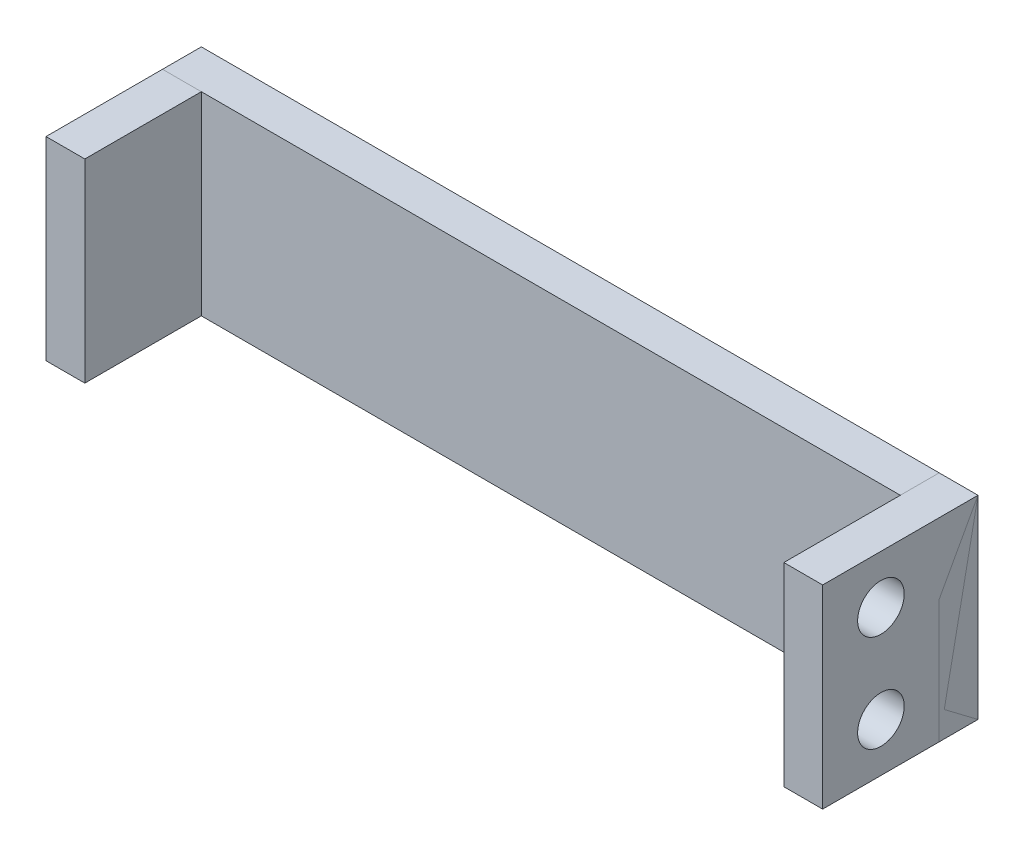
ISO-10303-21;
HEADER;
FILE_DESCRIPTION(('STEP AP214'),'2;1');
FILE_NAME('part.step','',(''),(''),'','','');
FILE_SCHEMA(('AUTOMOTIVE_DESIGN { 1 0 10303 214 1 1 1 1 }'));
ENDSEC;
DATA;
#1=APPLICATION_CONTEXT('core data for automotive mechanical design processes');
#2=APPLICATION_PROTOCOL_DEFINITION('international standard','automotive_design',2000,#1);
#3=PRODUCT_CONTEXT('',#1,'mechanical');
#4=PRODUCT('Part','Part','',(#3));
#5=PRODUCT_RELATED_PRODUCT_CATEGORY('part','',(#4));
#6=PRODUCT_DEFINITION_FORMATION('','',#4);
#7=PRODUCT_DEFINITION_CONTEXT('part definition',#1,'design');
#8=PRODUCT_DEFINITION('design','',#6,#7);
#9=PRODUCT_DEFINITION_SHAPE('','',#8);
#10=(LENGTH_UNIT() NAMED_UNIT(*) SI_UNIT(.MILLI.,.METRE.));
#11=(NAMED_UNIT(*) PLANE_ANGLE_UNIT() SI_UNIT($,.RADIAN.));
#12=(NAMED_UNIT(*) SI_UNIT($,.STERADIAN.) SOLID_ANGLE_UNIT());
#13=UNCERTAINTY_MEASURE_WITH_UNIT(LENGTH_MEASURE(1.E-05),#10,'distance_accuracy_value','');
#14=(GEOMETRIC_REPRESENTATION_CONTEXT(3) GLOBAL_UNCERTAINTY_ASSIGNED_CONTEXT((#13)) GLOBAL_UNIT_ASSIGNED_CONTEXT((#10,
#11,#12)) REPRESENTATION_CONTEXT('',''));
#15=CARTESIAN_POINT('',(0.,0.,0.));
#16=DIRECTION('',(0.,0.,1.));
#17=DIRECTION('',(1.,0.,0.));
#18=AXIS2_PLACEMENT_3D('',#15,#16,#17);
#19=CARTESIAN_POINT('',(-45.72,12.7,-10.16));
#20=DIRECTION('',(0.,0.,-1.));
#21=DIRECTION('',(0.,1.,0.));
#22=AXIS2_PLACEMENT_3D('',#19,#20,#21);
#23=PLANE('',#22);
#24=DIRECTION('',(0.,-1.,0.));
#25=VECTOR('',#24,1.);
#26=CARTESIAN_POINT('',(-48.26,12.7,-10.16));
#27=LINE('',#26,#25);
#28=CARTESIAN_POINT('',(-48.26,12.7,-10.16));
#29=VERTEX_POINT('',#28);
#30=CARTESIAN_POINT('',(-48.26,0.,-10.16));
#31=VERTEX_POINT('',#30);
#32=EDGE_CURVE('E118',#29,#31,#27,.T.);
#33=ORIENTED_EDGE('',*,*,#32,.F.);
#34=DIRECTION('',(-1.,0.,0.));
#35=VECTOR('',#34,1.);
#36=CARTESIAN_POINT('',(-45.72,12.7,-10.16));
#37=LINE('',#36,#35);
#38=CARTESIAN_POINT('',(-45.72,12.7,-10.16));
#39=VERTEX_POINT('',#38);
#40=EDGE_CURVE('E12',#39,#29,#37,.T.);
#41=ORIENTED_EDGE('',*,*,#40,.F.);
#42=DIRECTION('',(0.,-1.,0.));
#43=VECTOR('',#42,1.);
#44=CARTESIAN_POINT('',(-45.72,12.7,-10.16));
#45=LINE('',#44,#43);
#46=CARTESIAN_POINT('',(-45.72,0.,-10.16));
#47=VERTEX_POINT('',#46);
#48=EDGE_CURVE('E112',#39,#47,#45,.T.);
#49=ORIENTED_EDGE('',*,*,#48,.T.);
#50=DIRECTION('',(-1.,0.,0.));
#51=VECTOR('',#50,1.);
#52=CARTESIAN_POINT('',(-45.72,0.,-10.16));
#53=LINE('',#52,#51);
#54=EDGE_CURVE('E57',#47,#31,#53,.T.);
#55=ORIENTED_EDGE('',*,*,#54,.T.);
#56=EDGE_LOOP('',(#33,#41,#49,#55));
#57=FACE_BOUND('',#56,.T.);
#58=ADVANCED_FACE('F54',(#57),#23,.T.);
#59=CARTESIAN_POINT('',(-45.72,12.7,-10.16));
#60=DIRECTION('',(0.,1.,0.));
#61=DIRECTION('',(0.,0.,1.));
#62=AXIS2_PLACEMENT_3D('',#59,#60,#61);
#63=PLANE('',#62);
#64=DIRECTION('',(0.,0.,-1.));
#65=VECTOR('',#64,1.);
#66=CARTESIAN_POINT('',(-48.26,12.7,-10.16));
#67=LINE('',#66,#65);
#68=CARTESIAN_POINT('',(-48.26,12.7,0.));
#69=VERTEX_POINT('',#68);
#70=EDGE_CURVE('E114',#69,#29,#67,.T.);
#71=ORIENTED_EDGE('',*,*,#70,.F.);
#72=DIRECTION('',(-1.,0.,0.));
#73=VECTOR('',#72,1.);
#74=CARTESIAN_POINT('',(-45.72,12.7,0.));
#75=LINE('',#74,#73);
#76=CARTESIAN_POINT('',(-45.72,12.7,0.));
#77=VERTEX_POINT('',#76);
#78=EDGE_CURVE('E63',#77,#69,#75,.T.);
#79=ORIENTED_EDGE('',*,*,#78,.F.);
#80=DIRECTION('',(0.,0.,-1.));
#81=VECTOR('',#80,1.);
#82=CARTESIAN_POINT('',(-45.72,12.7,-10.16));
#83=LINE('',#82,#81);
#84=EDGE_CURVE('E109',#77,#39,#83,.T.);
#85=ORIENTED_EDGE('',*,*,#84,.T.);
#86=ORIENTED_EDGE('',*,*,#40,.T.);
#87=EDGE_LOOP('',(#71,#79,#85,#86));
#88=FACE_BOUND('',#87,.T.);
#89=ADVANCED_FACE('F128',(#88),#63,.T.);
#90=CARTESIAN_POINT('',(-45.72,12.7,0.));
#91=DIRECTION('',(0.,0.,1.));
#92=DIRECTION('',(0.,-1.,0.));
#93=AXIS2_PLACEMENT_3D('',#90,#91,#92);
#94=PLANE('',#93);
#95=DIRECTION('',(0.,1.,0.));
#96=VECTOR('',#95,1.);
#97=CARTESIAN_POINT('',(-48.26,12.7,0.));
#98=LINE('',#97,#96);
#99=CARTESIAN_POINT('',(-48.26,0.,0.));
#100=VERTEX_POINT('',#99);
#101=EDGE_CURVE('E104',#100,#69,#98,.T.);
#102=ORIENTED_EDGE('',*,*,#101,.F.);
#103=DIRECTION('',(-1.,0.,0.));
#104=VECTOR('',#103,1.);
#105=CARTESIAN_POINT('',(-45.72,0.,0.));
#106=LINE('',#105,#104);
#107=CARTESIAN_POINT('',(-45.72,0.,0.));
#108=VERTEX_POINT('',#107);
#109=EDGE_CURVE('E99',#108,#100,#106,.T.);
#110=ORIENTED_EDGE('',*,*,#109,.F.);
#111=DIRECTION('',(0.,1.,0.));
#112=VECTOR('',#111,1.);
#113=CARTESIAN_POINT('',(-45.72,12.7,0.));
#114=LINE('',#113,#112);
#115=EDGE_CURVE('E102',#108,#77,#114,.T.);
#116=ORIENTED_EDGE('',*,*,#115,.T.);
#117=ORIENTED_EDGE('',*,*,#78,.T.);
#118=EDGE_LOOP('',(#102,#110,#116,#117));
#119=FACE_BOUND('',#118,.T.);
#120=ADVANCED_FACE('F101',(#119),#94,.T.);
#121=CARTESIAN_POINT('',(-45.72,0.,-10.16));
#122=DIRECTION('',(0.,-1.,0.));
#123=DIRECTION('',(0.,0.,-1.));
#124=AXIS2_PLACEMENT_3D('',#121,#122,#123);
#125=PLANE('',#124);
#126=DIRECTION('',(0.,0.,1.));
#127=VECTOR('',#126,1.);
#128=CARTESIAN_POINT('',(-48.26,0.,-10.16));
#129=LINE('',#128,#127);
#130=EDGE_CURVE('E121',#31,#100,#129,.T.);
#131=ORIENTED_EDGE('',*,*,#130,.F.);
#132=ORIENTED_EDGE('',*,*,#54,.F.);
#133=DIRECTION('',(0.,0.,1.));
#134=VECTOR('',#133,1.);
#135=CARTESIAN_POINT('',(-45.72,0.,-10.16));
#136=LINE('',#135,#134);
#137=EDGE_CURVE('E108',#47,#108,#136,.T.);
#138=ORIENTED_EDGE('',*,*,#137,.T.);
#139=ORIENTED_EDGE('',*,*,#109,.T.);
#140=EDGE_LOOP('',(#131,#132,#138,#139));
#141=FACE_BOUND('',#140,.T.);
#142=ADVANCED_FACE('F111',(#141),#125,.T.);
#143=CARTESIAN_POINT('',(-45.72,0.,0.));
#144=DIRECTION('',(-1.,0.,0.));
#145=DIRECTION('',(0.,0.,1.));
#146=AXIS2_PLACEMENT_3D('',#143,#144,#145);
#147=PLANE('',#146);
#148=ORIENTED_EDGE('',*,*,#48,.F.);
#149=ORIENTED_EDGE('',*,*,#84,.F.);
#150=ORIENTED_EDGE('',*,*,#115,.F.);
#151=ORIENTED_EDGE('',*,*,#137,.F.);
#152=EDGE_LOOP('',(#148,#149,#150,#151));
#153=FACE_BOUND('',#152,.T.);
#154=ADVANCED_FACE('F107',(#153),#147,.F.);
#155=CARTESIAN_POINT('',(-48.26,0.,0.));
#156=DIRECTION('',(-1.,0.,0.));
#157=DIRECTION('',(0.,0.,1.));
#158=AXIS2_PLACEMENT_3D('',#155,#156,#157);
#159=PLANE('',#158);
#160=ORIENTED_EDGE('',*,*,#32,.T.);
#161=ORIENTED_EDGE('',*,*,#130,.T.);
#162=ORIENTED_EDGE('',*,*,#101,.T.);
#163=ORIENTED_EDGE('',*,*,#70,.T.);
#164=EDGE_LOOP('',(#160,#161,#162,#163));
#165=FACE_BOUND('',#164,.T.);
#166=ADVANCED_FACE('F127',(#165),#159,.T.);
#167=CLOSED_SHELL('',(#58,#89,#120,#142,#154,#166));
#168=MANIFOLD_SOLID_BREP('B2',#167);
#169=CARTESIAN_POINT('',(-48.26,12.7,-7.62));
#170=DIRECTION('',(0.,0.,1.));
#171=DIRECTION('',(0.,-1.,0.));
#172=AXIS2_PLACEMENT_3D('',#169,#170,#171);
#173=PLANE('',#172);
#174=DIRECTION('',(0.,-1.,0.));
#175=VECTOR('',#174,1.);
#176=CARTESIAN_POINT('',(2.54,12.7,-7.62));
#177=LINE('',#176,#175);
#178=CARTESIAN_POINT('',(2.54,12.7,-7.62));
#179=VERTEX_POINT('',#178);
#180=CARTESIAN_POINT('',(2.54,0.,-7.62));
#181=VERTEX_POINT('',#180);
#182=EDGE_CURVE('E269',#179,#181,#177,.T.);
#183=ORIENTED_EDGE('',*,*,#182,.F.);
#184=DIRECTION('',(1.,0.,0.));
#185=VECTOR('',#184,1.);
#186=CARTESIAN_POINT('',(-48.26,12.7,-7.62));
#187=LINE('',#186,#185);
#188=CARTESIAN_POINT('',(-48.26,12.7,-7.62));
#189=VERTEX_POINT('',#188);
#190=EDGE_CURVE('E52',#189,#179,#187,.T.);
#191=ORIENTED_EDGE('',*,*,#190,.F.);
#192=DIRECTION('',(0.,-1.,0.));
#193=VECTOR('',#192,1.);
#194=CARTESIAN_POINT('',(-48.26,12.7,-7.62));
#195=LINE('',#194,#193);
#196=CARTESIAN_POINT('',(-48.26,0.,-7.62));
#197=VERTEX_POINT('',#196);
#198=EDGE_CURVE('E261',#189,#197,#195,.T.);
#199=ORIENTED_EDGE('',*,*,#198,.T.);
#200=DIRECTION('',(1.,0.,0.));
#201=VECTOR('',#200,1.);
#202=CARTESIAN_POINT('',(-48.26,0.,-7.62));
#203=LINE('',#202,#201);
#204=EDGE_CURVE('E202',#197,#181,#203,.T.);
#205=ORIENTED_EDGE('',*,*,#204,.T.);
#206=EDGE_LOOP('',(#183,#191,#199,#205));
#207=FACE_BOUND('',#206,.T.);
#208=ADVANCED_FACE('F199',(#207),#173,.T.);
#209=CARTESIAN_POINT('',(-48.26,12.7,-7.62));
#210=DIRECTION('',(0.,1.,0.));
#211=DIRECTION('',(0.,0.,1.));
#212=AXIS2_PLACEMENT_3D('',#209,#210,#211);
#213=PLANE('',#212);
#214=DIRECTION('',(0.,0.,1.));
#215=VECTOR('',#214,1.);
#216=CARTESIAN_POINT('',(2.54,12.7,-7.62));
#217=LINE('',#216,#215);
#218=CARTESIAN_POINT('',(2.54,12.7,-10.16));
#219=VERTEX_POINT('',#218);
#220=EDGE_CURVE('E264',#219,#179,#217,.T.);
#221=ORIENTED_EDGE('',*,*,#220,.F.);
#222=DIRECTION('',(1.,0.,0.));
#223=VECTOR('',#222,1.);
#224=CARTESIAN_POINT('',(-48.26,12.7,-10.16));
#225=LINE('',#224,#223);
#226=CARTESIAN_POINT('',(-48.26,12.7,-10.16));
#227=VERTEX_POINT('',#226);
#228=EDGE_CURVE('E209',#227,#219,#225,.T.);
#229=ORIENTED_EDGE('',*,*,#228,.F.);
#230=DIRECTION('',(0.,0.,1.));
#231=VECTOR('',#230,1.);
#232=CARTESIAN_POINT('',(-48.26,12.7,-7.62));
#233=LINE('',#232,#231);
#234=EDGE_CURVE('E256',#227,#189,#233,.T.);
#235=ORIENTED_EDGE('',*,*,#234,.T.);
#236=ORIENTED_EDGE('',*,*,#190,.T.);
#237=EDGE_LOOP('',(#221,#229,#235,#236));
#238=FACE_BOUND('',#237,.T.);
#239=ADVANCED_FACE('F285',(#238),#213,.T.);
#240=CARTESIAN_POINT('',(-48.26,12.7,-10.16));
#241=DIRECTION('',(0.,0.,-1.));
#242=DIRECTION('',(0.,1.,0.));
#243=AXIS2_PLACEMENT_3D('',#240,#241,#242);
#244=PLANE('',#243);
#245=DIRECTION('',(0.,1.,0.));
#246=VECTOR('',#245,1.);
#247=CARTESIAN_POINT('',(2.54,12.7,-10.16));
#248=LINE('',#247,#246);
#249=CARTESIAN_POINT('',(2.54,0.,-10.16));
#250=VERTEX_POINT('',#249);
#251=EDGE_CURVE('E250',#250,#219,#248,.T.);
#252=ORIENTED_EDGE('',*,*,#251,.F.);
#253=DIRECTION('',(1.,0.,0.));
#254=VECTOR('',#253,1.);
#255=CARTESIAN_POINT('',(-48.26,0.,-10.16));
#256=LINE('',#255,#254);
#257=CARTESIAN_POINT('',(-48.26,0.,-10.16));
#258=VERTEX_POINT('',#257);
#259=EDGE_CURVE('E245',#258,#250,#256,.T.);
#260=ORIENTED_EDGE('',*,*,#259,.F.);
#261=DIRECTION('',(0.,1.,0.));
#262=VECTOR('',#261,1.);
#263=CARTESIAN_POINT('',(-48.26,12.7,-10.16));
#264=LINE('',#263,#262);
#265=EDGE_CURVE('E248',#258,#227,#264,.T.);
#266=ORIENTED_EDGE('',*,*,#265,.T.);
#267=ORIENTED_EDGE('',*,*,#228,.T.);
#268=EDGE_LOOP('',(#252,#260,#266,#267));
#269=FACE_BOUND('',#268,.T.);
#270=ADVANCED_FACE('F247',(#269),#244,.T.);
#271=CARTESIAN_POINT('',(-48.26,0.,-7.62));
#272=DIRECTION('',(0.,-1.,0.));
#273=DIRECTION('',(0.,0.,-1.));
#274=AXIS2_PLACEMENT_3D('',#271,#272,#273);
#275=PLANE('',#274);
#276=DIRECTION('',(0.,0.,-1.));
#277=VECTOR('',#276,1.);
#278=CARTESIAN_POINT('',(2.54,0.,-7.62));
#279=LINE('',#278,#277);
#280=EDGE_CURVE('E273',#181,#250,#279,.T.);
#281=ORIENTED_EDGE('',*,*,#280,.F.);
#282=ORIENTED_EDGE('',*,*,#204,.F.);
#283=DIRECTION('',(0.,0.,-1.));
#284=VECTOR('',#283,1.);
#285=CARTESIAN_POINT('',(-48.26,0.,-7.62));
#286=LINE('',#285,#284);
#287=EDGE_CURVE('E255',#197,#258,#286,.T.);
#288=ORIENTED_EDGE('',*,*,#287,.T.);
#289=ORIENTED_EDGE('',*,*,#259,.T.);
#290=EDGE_LOOP('',(#281,#282,#288,#289));
#291=FACE_BOUND('',#290,.T.);
#292=ADVANCED_FACE('F259',(#291),#275,.T.);
#293=CARTESIAN_POINT('',(-48.26,0.,0.));
#294=DIRECTION('',(1.,0.,0.));
#295=DIRECTION('',(0.,0.,-1.));
#296=AXIS2_PLACEMENT_3D('',#293,#294,#295);
#297=PLANE('',#296);
#298=ORIENTED_EDGE('',*,*,#198,.F.);
#299=ORIENTED_EDGE('',*,*,#234,.F.);
#300=ORIENTED_EDGE('',*,*,#265,.F.);
#301=ORIENTED_EDGE('',*,*,#287,.F.);
#302=EDGE_LOOP('',(#298,#299,#300,#301));
#303=FACE_BOUND('',#302,.T.);
#304=ADVANCED_FACE('F254',(#303),#297,.F.);
#305=CARTESIAN_POINT('',(2.54,0.,0.));
#306=DIRECTION('',(1.,0.,0.));
#307=DIRECTION('',(0.,0.,-1.));
#308=AXIS2_PLACEMENT_3D('',#305,#306,#307);
#309=PLANE('',#308);
#310=ORIENTED_EDGE('',*,*,#182,.T.);
#311=ORIENTED_EDGE('',*,*,#280,.T.);
#312=ORIENTED_EDGE('',*,*,#251,.T.);
#313=ORIENTED_EDGE('',*,*,#220,.T.);
#314=EDGE_LOOP('',(#310,#311,#312,#313));
#315=FACE_BOUND('',#314,.T.);
#316=ADVANCED_FACE('F284',(#315),#309,.T.);
#317=CLOSED_SHELL('',(#208,#239,#270,#292,#304,#316));
#318=MANIFOLD_SOLID_BREP('B6',#317);
#319=CARTESIAN_POINT('',(2.54,0.,0.));
#320=DIRECTION('',(-1.,0.,0.));
#321=DIRECTION('',(0.,0.,1.));
#322=AXIS2_PLACEMENT_3D('',#319,#320,#321);
#323=PLANE('',#322);
#324=DIRECTION('',(0.,-1.,0.));
#325=VECTOR('',#324,1.);
#326=CARTESIAN_POINT('',(2.54,0.,0.));
#327=LINE('',#326,#325);
#328=CARTESIAN_POINT('',(2.54,12.7,0.));
#329=VERTEX_POINT('',#328);
#330=CARTESIAN_POINT('',(2.54,0.,0.));
#331=VERTEX_POINT('',#330);
#332=EDGE_CURVE('E399',#329,#331,#327,.T.);
#333=ORIENTED_EDGE('',*,*,#332,.T.);
#334=DIRECTION('',(0.,0.,-1.));
#335=VECTOR('',#334,1.);
#336=CARTESIAN_POINT('',(2.54,0.,0.));
#337=LINE('',#336,#335);
#338=CARTESIAN_POINT('',(2.54,0.,-10.16));
#339=VERTEX_POINT('',#338);
#340=EDGE_CURVE('E394',#331,#339,#337,.T.);
#341=ORIENTED_EDGE('',*,*,#340,.T.);
#342=DIRECTION('',(0.,1.,0.));
#343=VECTOR('',#342,1.);
#344=CARTESIAN_POINT('',(2.54,0.,-10.16));
#345=LINE('',#344,#343);
#346=CARTESIAN_POINT('',(2.54,12.7,-10.16));
#347=VERTEX_POINT('',#346);
#348=EDGE_CURVE('E397',#339,#347,#345,.T.);
#349=ORIENTED_EDGE('',*,*,#348,.T.);
#350=DIRECTION('',(0.,0.,1.));
#351=VECTOR('',#350,1.);
#352=CARTESIAN_POINT('',(2.54,12.7,0.));
#353=LINE('',#352,#351);
#354=EDGE_CURVE('E364',#347,#329,#353,.T.);
#355=ORIENTED_EDGE('',*,*,#354,.T.);
#356=EDGE_LOOP('',(#333,#341,#349,#355));
#357=FACE_BOUND('',#356,.T.);
#358=CARTESIAN_POINT('',(2.54,9.525,-3.81));
#359=DIRECTION('',(1.,0.,0.));
#360=DIRECTION('',(0.,0.,-1.));
#361=AXIS2_PLACEMENT_3D('',#358,#359,#360);
#362=CIRCLE('',#361,1.524);
#363=CARTESIAN_POINT('',(2.54,9.525,-5.334));
#364=VERTEX_POINT('',#363);
#365=EDGE_CURVE('E414',#364,#364,#362,.T.);
#366=ORIENTED_EDGE('',*,*,#365,.F.);
#367=EDGE_LOOP('',(#366));
#368=FACE_BOUND('',#367,.T.);
#369=CARTESIAN_POINT('',(2.54,3.175,-3.81));
#370=DIRECTION('',(1.,0.,0.));
#371=DIRECTION('',(0.,0.,-1.));
#372=AXIS2_PLACEMENT_3D('',#369,#370,#371);
#373=CIRCLE('',#372,1.524);
#374=CARTESIAN_POINT('',(2.54,3.175,-5.334));
#375=VERTEX_POINT('',#374);
#376=EDGE_CURVE('E429',#375,#375,#373,.T.);
#377=ORIENTED_EDGE('',*,*,#376,.F.);
#378=EDGE_LOOP('',(#377));
#379=FACE_BOUND('',#378,.T.);
#380=ADVANCED_FACE('F347',(#357,#368,#379),#323,.F.);
#381=CARTESIAN_POINT('',(0.,0.,0.));
#382=DIRECTION('',(-1.,0.,0.));
#383=DIRECTION('',(0.,0.,1.));
#384=AXIS2_PLACEMENT_3D('',#381,#382,#383);
#385=PLANE('',#384);
#386=CARTESIAN_POINT('',(0.,9.525,-3.81));
#387=DIRECTION('',(1.,0.,0.));
#388=DIRECTION('',(0.,0.,-1.));
#389=AXIS2_PLACEMENT_3D('',#386,#387,#388);
#390=CIRCLE('',#389,1.524);
#391=CARTESIAN_POINT('',(0.,9.525,-5.334));
#392=VERTEX_POINT('',#391);
#393=EDGE_CURVE('E426',#392,#392,#390,.T.);
#394=ORIENTED_EDGE('',*,*,#393,.T.);
#395=EDGE_LOOP('',(#394));
#396=FACE_BOUND('',#395,.T.);
#397=DIRECTION('',(0.,-1.,0.));
#398=VECTOR('',#397,1.);
#399=CARTESIAN_POINT('',(0.,0.,0.));
#400=LINE('',#399,#398);
#401=CARTESIAN_POINT('',(0.,12.7,0.));
#402=VERTEX_POINT('',#401);
#403=CARTESIAN_POINT('',(0.,0.,0.));
#404=VERTEX_POINT('',#403);
#405=EDGE_CURVE('E411',#402,#404,#400,.T.);
#406=ORIENTED_EDGE('',*,*,#405,.F.);
#407=DIRECTION('',(0.,0.,1.));
#408=VECTOR('',#407,1.);
#409=CARTESIAN_POINT('',(0.,12.7,0.));
#410=LINE('',#409,#408);
#411=CARTESIAN_POINT('',(0.,12.7,-10.16));
#412=VERTEX_POINT('',#411);
#413=EDGE_CURVE('E387',#412,#402,#410,.T.);
#414=ORIENTED_EDGE('',*,*,#413,.F.);
#415=DIRECTION('',(0.,1.,0.));
#416=VECTOR('',#415,1.);
#417=CARTESIAN_POINT('',(0.,0.,-10.16));
#418=LINE('',#417,#416);
#419=CARTESIAN_POINT('',(0.,0.,-10.16));
#420=VERTEX_POINT('',#419);
#421=EDGE_CURVE('E381',#420,#412,#418,.T.);
#422=ORIENTED_EDGE('',*,*,#421,.F.);
#423=DIRECTION('',(0.,0.,-1.));
#424=VECTOR('',#423,1.);
#425=CARTESIAN_POINT('',(0.,0.,0.));
#426=LINE('',#425,#424);
#427=EDGE_CURVE('E403',#404,#420,#426,.T.);
#428=ORIENTED_EDGE('',*,*,#427,.F.);
#429=EDGE_LOOP('',(#406,#414,#422,#428));
#430=FACE_BOUND('',#429,.T.);
#431=CARTESIAN_POINT('',(0.,3.175,-3.81));
#432=DIRECTION('',(1.,0.,0.));
#433=DIRECTION('',(0.,0.,-1.));
#434=AXIS2_PLACEMENT_3D('',#431,#432,#433);
#435=CIRCLE('',#434,1.524);
#436=CARTESIAN_POINT('',(0.,3.175,-5.334));
#437=VERTEX_POINT('',#436);
#438=EDGE_CURVE('E432',#437,#437,#435,.T.);
#439=ORIENTED_EDGE('',*,*,#438,.T.);
#440=EDGE_LOOP('',(#439));
#441=FACE_BOUND('',#440,.T.);
#442=ADVANCED_FACE('F422',(#396,#430,#441),#385,.T.);
#443=CARTESIAN_POINT('',(2.54,0.,0.));
#444=DIRECTION('',(0.,0.,-1.));
#445=DIRECTION('',(0.,1.,0.));
#446=AXIS2_PLACEMENT_3D('',#443,#444,#445);
#447=PLANE('',#446);
#448=ORIENTED_EDGE('',*,*,#405,.T.);
#449=DIRECTION('',(-1.,0.,0.));
#450=VECTOR('',#449,1.);
#451=CARTESIAN_POINT('',(2.54,0.,0.));
#452=LINE('',#451,#450);
#453=EDGE_CURVE('E197',#331,#404,#452,.T.);
#454=ORIENTED_EDGE('',*,*,#453,.F.);
#455=ORIENTED_EDGE('',*,*,#332,.F.);
#456=DIRECTION('',(-1.,0.,0.));
#457=VECTOR('',#456,1.);
#458=CARTESIAN_POINT('',(2.54,12.7,0.));
#459=LINE('',#458,#457);
#460=EDGE_CURVE('E407',#329,#402,#459,.T.);
#461=ORIENTED_EDGE('',*,*,#460,.T.);
#462=EDGE_LOOP('',(#448,#454,#455,#461));
#463=FACE_BOUND('',#462,.T.);
#464=ADVANCED_FACE('F349',(#463),#447,.F.);
#465=CARTESIAN_POINT('',(2.54,0.,0.));
#466=DIRECTION('',(0.,1.,0.));
#467=DIRECTION('',(0.,0.,1.));
#468=AXIS2_PLACEMENT_3D('',#465,#466,#467);
#469=PLANE('',#468);
#470=ORIENTED_EDGE('',*,*,#427,.T.);
#471=DIRECTION('',(-1.,0.,0.));
#472=VECTOR('',#471,1.);
#473=CARTESIAN_POINT('',(2.54,0.,-10.16));
#474=LINE('',#473,#472);
#475=EDGE_CURVE('E356',#339,#420,#474,.T.);
#476=ORIENTED_EDGE('',*,*,#475,.F.);
#477=ORIENTED_EDGE('',*,*,#340,.F.);
#478=ORIENTED_EDGE('',*,*,#453,.T.);
#479=EDGE_LOOP('',(#470,#476,#477,#478));
#480=FACE_BOUND('',#479,.T.);
#481=ADVANCED_FACE('F402',(#480),#469,.F.);
#482=CARTESIAN_POINT('',(2.54,0.,-10.16));
#483=DIRECTION('',(0.,0.,1.));
#484=DIRECTION('',(0.,-1.,0.));
#485=AXIS2_PLACEMENT_3D('',#482,#483,#484);
#486=PLANE('',#485);
#487=ORIENTED_EDGE('',*,*,#421,.T.);
#488=DIRECTION('',(-1.,0.,0.));
#489=VECTOR('',#488,1.);
#490=CARTESIAN_POINT('',(2.54,12.7,-10.16));
#491=LINE('',#490,#489);
#492=EDGE_CURVE('E404',#347,#412,#491,.T.);
#493=ORIENTED_EDGE('',*,*,#492,.F.);
#494=ORIENTED_EDGE('',*,*,#348,.F.);
#495=ORIENTED_EDGE('',*,*,#475,.T.);
#496=EDGE_LOOP('',(#487,#493,#494,#495));
#497=FACE_BOUND('',#496,.T.);
#498=ADVANCED_FACE('F405',(#497),#486,.F.);
#499=CARTESIAN_POINT('',(2.54,12.7,0.));
#500=DIRECTION('',(0.,-1.,0.));
#501=DIRECTION('',(0.,0.,-1.));
#502=AXIS2_PLACEMENT_3D('',#499,#500,#501);
#503=PLANE('',#502);
#504=ORIENTED_EDGE('',*,*,#413,.T.);
#505=ORIENTED_EDGE('',*,*,#460,.F.);
#506=ORIENTED_EDGE('',*,*,#354,.F.);
#507=ORIENTED_EDGE('',*,*,#492,.T.);
#508=EDGE_LOOP('',(#504,#505,#506,#507));
#509=FACE_BOUND('',#508,.T.);
#510=ADVANCED_FACE('F419',(#509),#503,.F.);
#511=CARTESIAN_POINT('',(2.54,9.525,-3.81));
#512=DIRECTION('',(-1.,0.,0.));
#513=DIRECTION('',(0.,0.,1.));
#514=AXIS2_PLACEMENT_3D('',#511,#512,#513);
#515=CYLINDRICAL_SURFACE('',#514,1.524);
#516=ORIENTED_EDGE('',*,*,#365,.T.);
#517=EDGE_LOOP('',(#516));
#518=FACE_BOUND('',#517,.T.);
#519=ORIENTED_EDGE('',*,*,#393,.F.);
#520=EDGE_LOOP('',(#519));
#521=FACE_BOUND('',#520,.T.);
#522=ADVANCED_FACE('F449',(#518,#521),#515,.F.);
#523=CARTESIAN_POINT('',(2.54,3.175,-3.81));
#524=DIRECTION('',(-1.,0.,0.));
#525=DIRECTION('',(0.,0.,1.));
#526=AXIS2_PLACEMENT_3D('',#523,#524,#525);
#527=CYLINDRICAL_SURFACE('',#526,1.524);
#528=ORIENTED_EDGE('',*,*,#376,.T.);
#529=EDGE_LOOP('',(#528));
#530=FACE_BOUND('',#529,.T.);
#531=ORIENTED_EDGE('',*,*,#438,.F.);
#532=EDGE_LOOP('',(#531));
#533=FACE_BOUND('',#532,.T.);
#534=ADVANCED_FACE('F438',(#530,#533),#527,.F.);
#535=CLOSED_SHELL('',(#380,#442,#464,#481,#498,#510,#522,#534));
#536=MANIFOLD_SOLID_BREP('B46',#535);
#537=ADVANCED_BREP_SHAPE_REPRESENTATION('',(#18,#168,#318,#536),#14);
#538=SHAPE_DEFINITION_REPRESENTATION(#9,#537);
ENDSEC;
END-ISO-10303-21;
